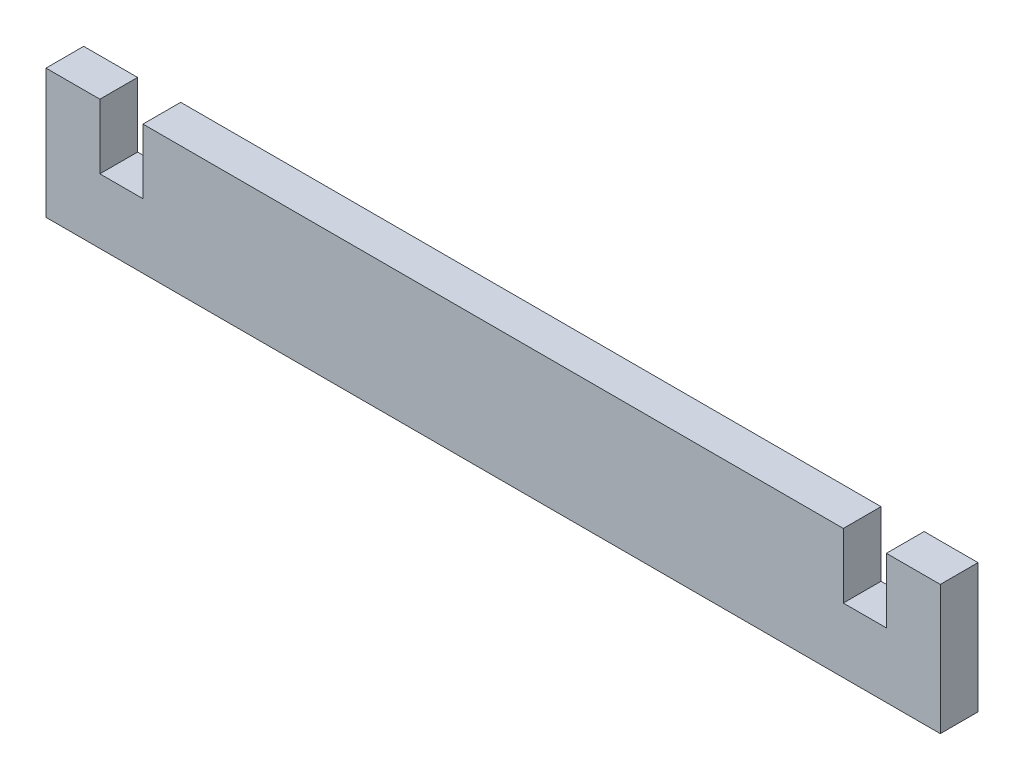
ISO-10303-21;
HEADER;
FILE_DESCRIPTION(('STEP AP214'),'2;1');
FILE_NAME('part.step','',(''),(''),'','','');
FILE_SCHEMA(('AUTOMOTIVE_DESIGN { 1 0 10303 214 1 1 1 1 }'));
ENDSEC;
DATA;
#1=APPLICATION_CONTEXT('core data for automotive mechanical design processes');
#2=APPLICATION_PROTOCOL_DEFINITION('international standard','automotive_design',2000,#1);
#3=PRODUCT_CONTEXT('',#1,'mechanical');
#4=PRODUCT('Part','Part','',(#3));
#5=PRODUCT_RELATED_PRODUCT_CATEGORY('part','',(#4));
#6=PRODUCT_DEFINITION_FORMATION('','',#4);
#7=PRODUCT_DEFINITION_CONTEXT('part definition',#1,'design');
#8=PRODUCT_DEFINITION('design','',#6,#7);
#9=PRODUCT_DEFINITION_SHAPE('','',#8);
#10=(LENGTH_UNIT() NAMED_UNIT(*) SI_UNIT(.MILLI.,.METRE.));
#11=(NAMED_UNIT(*) PLANE_ANGLE_UNIT() SI_UNIT($,.RADIAN.));
#12=(NAMED_UNIT(*) SI_UNIT($,.STERADIAN.) SOLID_ANGLE_UNIT());
#13=UNCERTAINTY_MEASURE_WITH_UNIT(LENGTH_MEASURE(1.E-05),#10,'distance_accuracy_value','');
#14=(GEOMETRIC_REPRESENTATION_CONTEXT(3) GLOBAL_UNCERTAINTY_ASSIGNED_CONTEXT((#13)) GLOBAL_UNIT_ASSIGNED_CONTEXT((#10,
#11,#12)) REPRESENTATION_CONTEXT('',''));
#15=CARTESIAN_POINT('',(0.,0.,0.));
#16=DIRECTION('',(0.,0.,1.));
#17=DIRECTION('',(1.,0.,0.));
#18=AXIS2_PLACEMENT_3D('',#15,#16,#17);
#19=CARTESIAN_POINT('',(32.5,6.,3.5));
#20=DIRECTION('',(-1.,0.,0.));
#21=DIRECTION('',(0.,0.,1.));
#22=AXIS2_PLACEMENT_3D('',#19,#20,#21);
#23=PLANE('',#22);
#24=DIRECTION('',(0.,1.,0.));
#25=VECTOR('',#24,1.);
#26=CARTESIAN_POINT('',(32.5,6.,0.));
#27=LINE('',#26,#25);
#28=CARTESIAN_POINT('',(32.5,0.,0.));
#29=VERTEX_POINT('',#28);
#30=CARTESIAN_POINT('',(32.5,6.,0.));
#31=VERTEX_POINT('',#30);
#32=EDGE_CURVE('E153',#29,#31,#27,.T.);
#33=ORIENTED_EDGE('',*,*,#32,.T.);
#34=DIRECTION('',(0.,0.,-1.));
#35=VECTOR('',#34,1.);
#36=CARTESIAN_POINT('',(32.5,6.,3.5));
#37=LINE('',#36,#35);
#38=CARTESIAN_POINT('',(32.5,6.,3.5));
#39=VERTEX_POINT('',#38);
#40=EDGE_CURVE('E11',#39,#31,#37,.T.);
#41=ORIENTED_EDGE('',*,*,#40,.F.);
#42=DIRECTION('',(0.,1.,0.));
#43=VECTOR('',#42,1.);
#44=CARTESIAN_POINT('',(32.5,6.,3.5));
#45=LINE('',#44,#43);
#46=CARTESIAN_POINT('',(32.5,0.,3.5));
#47=VERTEX_POINT('',#46);
#48=EDGE_CURVE('E175',#47,#39,#45,.T.);
#49=ORIENTED_EDGE('',*,*,#48,.F.);
#50=DIRECTION('',(0.,0.,-1.));
#51=VECTOR('',#50,1.);
#52=CARTESIAN_POINT('',(32.5,0.,3.5));
#53=LINE('',#52,#51);
#54=EDGE_CURVE('E149',#47,#29,#53,.T.);
#55=ORIENTED_EDGE('',*,*,#54,.T.);
#56=EDGE_LOOP('',(#33,#41,#49,#55));
#57=FACE_BOUND('',#56,.T.);
#58=ADVANCED_FACE('F33',(#57),#23,.F.);
#59=CARTESIAN_POINT('',(-32.5,6.00000000000001,3.5));
#60=DIRECTION('',(0.,-1.,0.));
#61=DIRECTION('',(1.,0.,0.));
#62=AXIS2_PLACEMENT_3D('',#59,#60,#61);
#63=PLANE('',#62);
#64=DIRECTION('',(-1.,0.,0.));
#65=VECTOR('',#64,1.);
#66=CARTESIAN_POINT('',(-32.5,6.00000000000001,0.));
#67=LINE('',#66,#65);
#68=CARTESIAN_POINT('',(-32.5,6.00000000000001,0.));
#69=VERTEX_POINT('',#68);
#70=EDGE_CURVE('E156',#31,#69,#67,.T.);
#71=ORIENTED_EDGE('',*,*,#70,.T.);
#72=DIRECTION('',(0.,0.,-1.));
#73=VECTOR('',#72,1.);
#74=CARTESIAN_POINT('',(-32.5,6.00000000000001,3.5));
#75=LINE('',#74,#73);
#76=CARTESIAN_POINT('',(-32.5,6.00000000000001,3.5));
#77=VERTEX_POINT('',#76);
#78=EDGE_CURVE('E41',#77,#69,#75,.T.);
#79=ORIENTED_EDGE('',*,*,#78,.F.);
#80=DIRECTION('',(-1.,0.,0.));
#81=VECTOR('',#80,1.);
#82=CARTESIAN_POINT('',(-32.5,6.00000000000001,3.5));
#83=LINE('',#82,#81);
#84=EDGE_CURVE('E104',#39,#77,#83,.T.);
#85=ORIENTED_EDGE('',*,*,#84,.F.);
#86=ORIENTED_EDGE('',*,*,#40,.T.);
#87=EDGE_LOOP('',(#71,#79,#85,#86));
#88=FACE_BOUND('',#87,.T.);
#89=ADVANCED_FACE('F253',(#88),#63,.F.);
#90=CARTESIAN_POINT('',(-32.5,6.00000000000001,3.5));
#91=DIRECTION('',(1.,0.,0.));
#92=DIRECTION('',(0.,0.,-1.));
#93=AXIS2_PLACEMENT_3D('',#90,#91,#92);
#94=PLANE('',#93);
#95=DIRECTION('',(0.,-1.,0.));
#96=VECTOR('',#95,1.);
#97=CARTESIAN_POINT('',(-32.5,6.00000000000001,0.));
#98=LINE('',#97,#96);
#99=CARTESIAN_POINT('',(-32.5,0.,0.));
#100=VERTEX_POINT('',#99);
#101=EDGE_CURVE('E158',#69,#100,#98,.T.);
#102=ORIENTED_EDGE('',*,*,#101,.T.);
#103=DIRECTION('',(0.,0.,-1.));
#104=VECTOR('',#103,1.);
#105=CARTESIAN_POINT('',(-32.5,0.,3.5));
#106=LINE('',#105,#104);
#107=CARTESIAN_POINT('',(-32.5,0.,3.5));
#108=VERTEX_POINT('',#107);
#109=EDGE_CURVE('E194',#108,#100,#106,.T.);
#110=ORIENTED_EDGE('',*,*,#109,.F.);
#111=DIRECTION('',(0.,-1.,0.));
#112=VECTOR('',#111,1.);
#113=CARTESIAN_POINT('',(-32.5,6.00000000000001,3.5));
#114=LINE('',#113,#112);
#115=EDGE_CURVE('E202',#77,#108,#114,.T.);
#116=ORIENTED_EDGE('',*,*,#115,.F.);
#117=ORIENTED_EDGE('',*,*,#78,.T.);
#118=EDGE_LOOP('',(#102,#110,#116,#117));
#119=FACE_BOUND('',#118,.T.);
#120=ADVANCED_FACE('F200',(#119),#94,.F.);
#121=CARTESIAN_POINT('',(-32.5,0.,3.5));
#122=DIRECTION('',(0.,-1.,0.));
#123=DIRECTION('',(1.,0.,0.));
#124=AXIS2_PLACEMENT_3D('',#121,#122,#123);
#125=PLANE('',#124);
#126=DIRECTION('',(-1.,0.,0.));
#127=VECTOR('',#126,1.);
#128=CARTESIAN_POINT('',(-32.5,0.,0.));
#129=LINE('',#128,#127);
#130=CARTESIAN_POINT('',(-36.5,0.,0.));
#131=VERTEX_POINT('',#130);
#132=EDGE_CURVE('E160',#100,#131,#129,.T.);
#133=ORIENTED_EDGE('',*,*,#132,.T.);
#134=DIRECTION('',(0.,0.,-1.));
#135=VECTOR('',#134,1.);
#136=CARTESIAN_POINT('',(-36.5,0.,3.5));
#137=LINE('',#136,#135);
#138=CARTESIAN_POINT('',(-36.5,0.,3.5));
#139=VERTEX_POINT('',#138);
#140=EDGE_CURVE('E191',#139,#131,#137,.T.);
#141=ORIENTED_EDGE('',*,*,#140,.F.);
#142=DIRECTION('',(-1.,0.,0.));
#143=VECTOR('',#142,1.);
#144=CARTESIAN_POINT('',(-32.5,0.,3.5));
#145=LINE('',#144,#143);
#146=EDGE_CURVE('E220',#108,#139,#145,.T.);
#147=ORIENTED_EDGE('',*,*,#146,.F.);
#148=ORIENTED_EDGE('',*,*,#109,.T.);
#149=EDGE_LOOP('',(#133,#141,#147,#148));
#150=FACE_BOUND('',#149,.T.);
#151=ADVANCED_FACE('F211',(#150),#125,.F.);
#152=CARTESIAN_POINT('',(-36.5,0.,3.5));
#153=DIRECTION('',(-1.,0.,0.));
#154=DIRECTION('',(0.,0.,1.));
#155=AXIS2_PLACEMENT_3D('',#152,#153,#154);
#156=PLANE('',#155);
#157=DIRECTION('',(0.,1.,0.));
#158=VECTOR('',#157,1.);
#159=CARTESIAN_POINT('',(-36.5,0.,0.));
#160=LINE('',#159,#158);
#161=CARTESIAN_POINT('',(-36.5,6.00000000000001,0.));
#162=VERTEX_POINT('',#161);
#163=EDGE_CURVE('E162',#131,#162,#160,.T.);
#164=ORIENTED_EDGE('',*,*,#163,.T.);
#165=DIRECTION('',(0.,0.,-1.));
#166=VECTOR('',#165,1.);
#167=CARTESIAN_POINT('',(-36.5,6.00000000000001,3.5));
#168=LINE('',#167,#166);
#169=CARTESIAN_POINT('',(-36.5,6.00000000000001,3.5));
#170=VERTEX_POINT('',#169);
#171=EDGE_CURVE('E188',#170,#162,#168,.T.);
#172=ORIENTED_EDGE('',*,*,#171,.F.);
#173=DIRECTION('',(0.,1.,0.));
#174=VECTOR('',#173,1.);
#175=CARTESIAN_POINT('',(-36.5,0.,3.5));
#176=LINE('',#175,#174);
#177=EDGE_CURVE('E217',#139,#170,#176,.T.);
#178=ORIENTED_EDGE('',*,*,#177,.F.);
#179=ORIENTED_EDGE('',*,*,#140,.T.);
#180=EDGE_LOOP('',(#164,#172,#178,#179));
#181=FACE_BOUND('',#180,.T.);
#182=ADVANCED_FACE('F215',(#181),#156,.F.);
#183=CARTESIAN_POINT('',(-36.5,6.00000000000001,3.5));
#184=DIRECTION('',(0.,-1.,0.));
#185=DIRECTION('',(1.,0.,0.));
#186=AXIS2_PLACEMENT_3D('',#183,#184,#185);
#187=PLANE('',#186);
#188=DIRECTION('',(-1.,0.,0.));
#189=VECTOR('',#188,1.);
#190=CARTESIAN_POINT('',(-36.5,6.00000000000001,0.));
#191=LINE('',#190,#189);
#192=CARTESIAN_POINT('',(-41.5,6.00000000000001,0.));
#193=VERTEX_POINT('',#192);
#194=EDGE_CURVE('E164',#162,#193,#191,.T.);
#195=ORIENTED_EDGE('',*,*,#194,.T.);
#196=DIRECTION('',(0.,0.,-1.));
#197=VECTOR('',#196,1.);
#198=CARTESIAN_POINT('',(-41.5,6.00000000000001,3.5));
#199=LINE('',#198,#197);
#200=CARTESIAN_POINT('',(-41.5,6.00000000000001,3.5));
#201=VERTEX_POINT('',#200);
#202=EDGE_CURVE('E185',#201,#193,#199,.T.);
#203=ORIENTED_EDGE('',*,*,#202,.F.);
#204=DIRECTION('',(-1.,0.,0.));
#205=VECTOR('',#204,1.);
#206=CARTESIAN_POINT('',(-36.5,6.00000000000001,3.5));
#207=LINE('',#206,#205);
#208=EDGE_CURVE('E219',#170,#201,#207,.T.);
#209=ORIENTED_EDGE('',*,*,#208,.F.);
#210=ORIENTED_EDGE('',*,*,#171,.T.);
#211=EDGE_LOOP('',(#195,#203,#209,#210));
#212=FACE_BOUND('',#211,.T.);
#213=ADVANCED_FACE('F266',(#212),#187,.F.);
#214=CARTESIAN_POINT('',(-41.5,6.00000000000001,3.5));
#215=DIRECTION('',(1.,0.,0.));
#216=DIRECTION('',(0.,0.,-1.));
#217=AXIS2_PLACEMENT_3D('',#214,#215,#216);
#218=PLANE('',#217);
#219=DIRECTION('',(0.,-1.,0.));
#220=VECTOR('',#219,1.);
#221=CARTESIAN_POINT('',(-41.5,6.00000000000001,0.));
#222=LINE('',#221,#220);
#223=CARTESIAN_POINT('',(-41.5,-5.99999999999999,0.));
#224=VERTEX_POINT('',#223);
#225=EDGE_CURVE('E166',#193,#224,#222,.T.);
#226=ORIENTED_EDGE('',*,*,#225,.T.);
#227=DIRECTION('',(0.,0.,-1.));
#228=VECTOR('',#227,1.);
#229=CARTESIAN_POINT('',(-41.5,-5.99999999999999,3.5));
#230=LINE('',#229,#228);
#231=CARTESIAN_POINT('',(-41.5,-5.99999999999999,3.5));
#232=VERTEX_POINT('',#231);
#233=EDGE_CURVE('E182',#232,#224,#230,.T.);
#234=ORIENTED_EDGE('',*,*,#233,.F.);
#235=DIRECTION('',(0.,-1.,0.));
#236=VECTOR('',#235,1.);
#237=CARTESIAN_POINT('',(-41.5,6.00000000000001,3.5));
#238=LINE('',#237,#236);
#239=EDGE_CURVE('E222',#201,#232,#238,.T.);
#240=ORIENTED_EDGE('',*,*,#239,.F.);
#241=ORIENTED_EDGE('',*,*,#202,.T.);
#242=EDGE_LOOP('',(#226,#234,#240,#241));
#243=FACE_BOUND('',#242,.T.);
#244=ADVANCED_FACE('F269',(#243),#218,.F.);
#245=CARTESIAN_POINT('',(41.5,-6.,3.5));
#246=DIRECTION('',(0.,1.,0.));
#247=DIRECTION('',(-1.,0.,0.));
#248=AXIS2_PLACEMENT_3D('',#245,#246,#247);
#249=PLANE('',#248);
#250=DIRECTION('',(1.,0.,0.));
#251=VECTOR('',#250,1.);
#252=CARTESIAN_POINT('',(41.5,-6.,0.));
#253=LINE('',#252,#251);
#254=CARTESIAN_POINT('',(41.5,-6.,0.));
#255=VERTEX_POINT('',#254);
#256=EDGE_CURVE('E168',#224,#255,#253,.T.);
#257=ORIENTED_EDGE('',*,*,#256,.T.);
#258=DIRECTION('',(0.,0.,-1.));
#259=VECTOR('',#258,1.);
#260=CARTESIAN_POINT('',(41.5,-6.,3.5));
#261=LINE('',#260,#259);
#262=CARTESIAN_POINT('',(41.5,-6.,3.5));
#263=VERTEX_POINT('',#262);
#264=EDGE_CURVE('E179',#263,#255,#261,.T.);
#265=ORIENTED_EDGE('',*,*,#264,.F.);
#266=DIRECTION('',(1.,0.,0.));
#267=VECTOR('',#266,1.);
#268=CARTESIAN_POINT('',(41.5,-6.,3.5));
#269=LINE('',#268,#267);
#270=EDGE_CURVE('E228',#232,#263,#269,.T.);
#271=ORIENTED_EDGE('',*,*,#270,.F.);
#272=ORIENTED_EDGE('',*,*,#233,.T.);
#273=EDGE_LOOP('',(#257,#265,#271,#272));
#274=FACE_BOUND('',#273,.T.);
#275=ADVANCED_FACE('F234',(#274),#249,.F.);
#276=CARTESIAN_POINT('',(41.5,6.,3.5));
#277=DIRECTION('',(-1.,0.,0.));
#278=DIRECTION('',(0.,0.,1.));
#279=AXIS2_PLACEMENT_3D('',#276,#277,#278);
#280=PLANE('',#279);
#281=DIRECTION('',(0.,1.,0.));
#282=VECTOR('',#281,1.);
#283=CARTESIAN_POINT('',(41.5,6.,0.));
#284=LINE('',#283,#282);
#285=CARTESIAN_POINT('',(41.5,6.,0.));
#286=VERTEX_POINT('',#285);
#287=EDGE_CURVE('E170',#255,#286,#284,.T.);
#288=ORIENTED_EDGE('',*,*,#287,.T.);
#289=DIRECTION('',(0.,0.,-1.));
#290=VECTOR('',#289,1.);
#291=CARTESIAN_POINT('',(41.5,6.,3.5));
#292=LINE('',#291,#290);
#293=CARTESIAN_POINT('',(41.5,6.,3.5));
#294=VERTEX_POINT('',#293);
#295=EDGE_CURVE('E144',#294,#286,#292,.T.);
#296=ORIENTED_EDGE('',*,*,#295,.F.);
#297=DIRECTION('',(0.,1.,0.));
#298=VECTOR('',#297,1.);
#299=CARTESIAN_POINT('',(41.5,6.,3.5));
#300=LINE('',#299,#298);
#301=EDGE_CURVE('E135',#263,#294,#300,.T.);
#302=ORIENTED_EDGE('',*,*,#301,.F.);
#303=ORIENTED_EDGE('',*,*,#264,.T.);
#304=EDGE_LOOP('',(#288,#296,#302,#303));
#305=FACE_BOUND('',#304,.T.);
#306=ADVANCED_FACE('F238',(#305),#280,.F.);
#307=CARTESIAN_POINT('',(36.5,6.,3.5));
#308=DIRECTION('',(0.,-1.,0.));
#309=DIRECTION('',(0.,0.,-1.));
#310=AXIS2_PLACEMENT_3D('',#307,#308,#309);
#311=PLANE('',#310);
#312=DIRECTION('',(-1.,0.,0.));
#313=VECTOR('',#312,1.);
#314=CARTESIAN_POINT('',(36.5,6.,0.));
#315=LINE('',#314,#313);
#316=CARTESIAN_POINT('',(36.5,6.,0.));
#317=VERTEX_POINT('',#316);
#318=EDGE_CURVE('E143',#286,#317,#315,.T.);
#319=ORIENTED_EDGE('',*,*,#318,.T.);
#320=DIRECTION('',(0.,0.,-1.));
#321=VECTOR('',#320,1.);
#322=CARTESIAN_POINT('',(36.5,6.,3.5));
#323=LINE('',#322,#321);
#324=CARTESIAN_POINT('',(36.5,6.,3.5));
#325=VERTEX_POINT('',#324);
#326=EDGE_CURVE('E140',#325,#317,#323,.T.);
#327=ORIENTED_EDGE('',*,*,#326,.F.);
#328=DIRECTION('',(-1.,0.,0.));
#329=VECTOR('',#328,1.);
#330=CARTESIAN_POINT('',(36.5,6.,3.5));
#331=LINE('',#330,#329);
#332=EDGE_CURVE('E129',#294,#325,#331,.T.);
#333=ORIENTED_EDGE('',*,*,#332,.F.);
#334=ORIENTED_EDGE('',*,*,#295,.T.);
#335=EDGE_LOOP('',(#319,#327,#333,#334));
#336=FACE_BOUND('',#335,.T.);
#337=ADVANCED_FACE('F141',(#336),#311,.F.);
#338=CARTESIAN_POINT('',(36.5,0.,3.5));
#339=DIRECTION('',(1.,0.,0.));
#340=DIRECTION('',(0.,0.,-1.));
#341=AXIS2_PLACEMENT_3D('',#338,#339,#340);
#342=PLANE('',#341);
#343=DIRECTION('',(0.,-1.,0.));
#344=VECTOR('',#343,1.);
#345=CARTESIAN_POINT('',(36.5,0.,0.));
#346=LINE('',#345,#344);
#347=CARTESIAN_POINT('',(36.5,0.,0.));
#348=VERTEX_POINT('',#347);
#349=EDGE_CURVE('E90',#317,#348,#346,.T.);
#350=ORIENTED_EDGE('',*,*,#349,.T.);
#351=DIRECTION('',(0.,0.,-1.));
#352=VECTOR('',#351,1.);
#353=CARTESIAN_POINT('',(36.5,0.,3.5));
#354=LINE('',#353,#352);
#355=CARTESIAN_POINT('',(36.5,0.,3.5));
#356=VERTEX_POINT('',#355);
#357=EDGE_CURVE('E145',#356,#348,#354,.T.);
#358=ORIENTED_EDGE('',*,*,#357,.F.);
#359=DIRECTION('',(0.,-1.,0.));
#360=VECTOR('',#359,1.);
#361=CARTESIAN_POINT('',(36.5,0.,3.5));
#362=LINE('',#361,#360);
#363=EDGE_CURVE('E133',#325,#356,#362,.T.);
#364=ORIENTED_EDGE('',*,*,#363,.F.);
#365=ORIENTED_EDGE('',*,*,#326,.T.);
#366=EDGE_LOOP('',(#350,#358,#364,#365));
#367=FACE_BOUND('',#366,.T.);
#368=ADVANCED_FACE('F147',(#367),#342,.F.);
#369=CARTESIAN_POINT('',(32.5,0.,3.5));
#370=DIRECTION('',(0.,-1.,0.));
#371=DIRECTION('',(0.,0.,-1.));
#372=AXIS2_PLACEMENT_3D('',#369,#370,#371);
#373=PLANE('',#372);
#374=DIRECTION('',(-1.,0.,0.));
#375=VECTOR('',#374,1.);
#376=CARTESIAN_POINT('',(32.5,0.,0.));
#377=LINE('',#376,#375);
#378=EDGE_CURVE('E96',#348,#29,#377,.T.);
#379=ORIENTED_EDGE('',*,*,#378,.T.);
#380=ORIENTED_EDGE('',*,*,#54,.F.);
#381=DIRECTION('',(-1.,0.,0.));
#382=VECTOR('',#381,1.);
#383=CARTESIAN_POINT('',(32.5,0.,3.5));
#384=LINE('',#383,#382);
#385=EDGE_CURVE('E49',#356,#47,#384,.T.);
#386=ORIENTED_EDGE('',*,*,#385,.F.);
#387=ORIENTED_EDGE('',*,*,#357,.T.);
#388=EDGE_LOOP('',(#379,#380,#386,#387));
#389=FACE_BOUND('',#388,.T.);
#390=ADVANCED_FACE('F242',(#389),#373,.F.);
#391=CARTESIAN_POINT('',(0.,0.,3.5));
#392=DIRECTION('',(0.,0.,1.));
#393=DIRECTION('',(1.,0.,0.));
#394=AXIS2_PLACEMENT_3D('',#391,#392,#393);
#395=PLANE('',#394);
#396=ORIENTED_EDGE('',*,*,#48,.T.);
#397=ORIENTED_EDGE('',*,*,#84,.T.);
#398=ORIENTED_EDGE('',*,*,#115,.T.);
#399=ORIENTED_EDGE('',*,*,#146,.T.);
#400=ORIENTED_EDGE('',*,*,#177,.T.);
#401=ORIENTED_EDGE('',*,*,#208,.T.);
#402=ORIENTED_EDGE('',*,*,#239,.T.);
#403=ORIENTED_EDGE('',*,*,#270,.T.);
#404=ORIENTED_EDGE('',*,*,#301,.T.);
#405=ORIENTED_EDGE('',*,*,#332,.T.);
#406=ORIENTED_EDGE('',*,*,#363,.T.);
#407=ORIENTED_EDGE('',*,*,#385,.T.);
#408=EDGE_LOOP('',(#396,#397,#398,#399,#400,#401,#402,#403,#404,#405,#406,#407));
#409=FACE_BOUND('',#408,.T.);
#410=ADVANCED_FACE('F131',(#409),#395,.T.);
#411=CARTESIAN_POINT('',(0.,0.,0.));
#412=DIRECTION('',(0.,0.,1.));
#413=DIRECTION('',(1.,0.,0.));
#414=AXIS2_PLACEMENT_3D('',#411,#412,#413);
#415=PLANE('',#414);
#416=ORIENTED_EDGE('',*,*,#32,.F.);
#417=ORIENTED_EDGE('',*,*,#378,.F.);
#418=ORIENTED_EDGE('',*,*,#349,.F.);
#419=ORIENTED_EDGE('',*,*,#318,.F.);
#420=ORIENTED_EDGE('',*,*,#287,.F.);
#421=ORIENTED_EDGE('',*,*,#256,.F.);
#422=ORIENTED_EDGE('',*,*,#225,.F.);
#423=ORIENTED_EDGE('',*,*,#194,.F.);
#424=ORIENTED_EDGE('',*,*,#163,.F.);
#425=ORIENTED_EDGE('',*,*,#132,.F.);
#426=ORIENTED_EDGE('',*,*,#101,.F.);
#427=ORIENTED_EDGE('',*,*,#70,.F.);
#428=EDGE_LOOP('',(#416,#417,#418,#419,#420,#421,#422,#423,#424,#425,#426,#427));
#429=FACE_BOUND('',#428,.T.);
#430=ADVANCED_FACE('F206',(#429),#415,.F.);
#431=CLOSED_SHELL('',(#58,#89,#120,#151,#182,#213,#244,#275,#306,#337,#368,#390,#410,#430));
#432=MANIFOLD_SOLID_BREP('B2',#431);
#433=ADVANCED_BREP_SHAPE_REPRESENTATION('',(#18,#432),#14);
#434=SHAPE_DEFINITION_REPRESENTATION(#9,#433);
ENDSEC;
END-ISO-10303-21;
